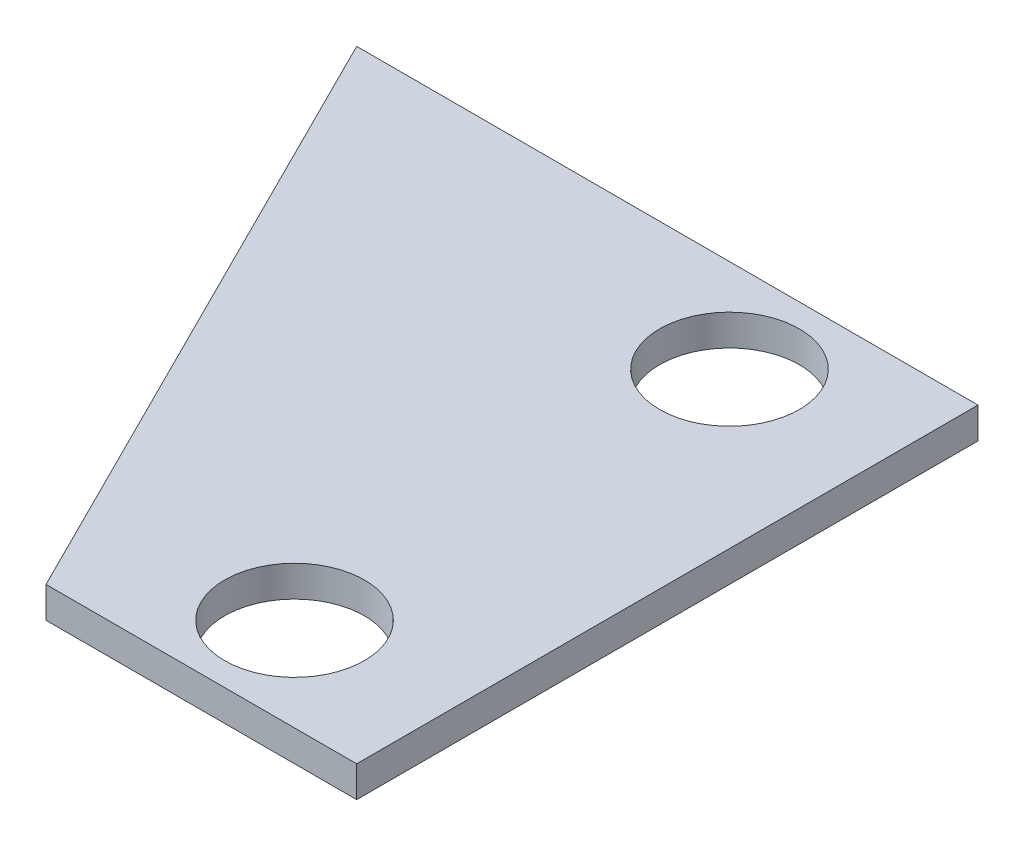
ISO-10303-21;
HEADER;
FILE_DESCRIPTION(('STEP AP214'),'2;1');
FILE_NAME('part.step','',(''),(''),'','','');
FILE_SCHEMA(('AUTOMOTIVE_DESIGN { 1 0 10303 214 1 1 1 1 }'));
ENDSEC;
DATA;
#1=APPLICATION_CONTEXT('core data for automotive mechanical design processes');
#2=APPLICATION_PROTOCOL_DEFINITION('international standard','automotive_design',2000,#1);
#3=PRODUCT_CONTEXT('',#1,'mechanical');
#4=PRODUCT('Part','Part','',(#3));
#5=PRODUCT_RELATED_PRODUCT_CATEGORY('part','',(#4));
#6=PRODUCT_DEFINITION_FORMATION('','',#4);
#7=PRODUCT_DEFINITION_CONTEXT('part definition',#1,'design');
#8=PRODUCT_DEFINITION('design','',#6,#7);
#9=PRODUCT_DEFINITION_SHAPE('','',#8);
#10=(LENGTH_UNIT() NAMED_UNIT(*) SI_UNIT(.MILLI.,.METRE.));
#11=(NAMED_UNIT(*) PLANE_ANGLE_UNIT() SI_UNIT($,.RADIAN.));
#12=(NAMED_UNIT(*) SI_UNIT($,.STERADIAN.) SOLID_ANGLE_UNIT());
#13=UNCERTAINTY_MEASURE_WITH_UNIT(LENGTH_MEASURE(1.E-05),#10,'distance_accuracy_value','');
#14=(GEOMETRIC_REPRESENTATION_CONTEXT(3) GLOBAL_UNCERTAINTY_ASSIGNED_CONTEXT((#13)) GLOBAL_UNIT_ASSIGNED_CONTEXT((#10,
#11,#12)) REPRESENTATION_CONTEXT('',''));
#15=CARTESIAN_POINT('',(0.,0.,0.));
#16=DIRECTION('',(0.,0.,1.));
#17=DIRECTION('',(1.,0.,0.));
#18=AXIS2_PLACEMENT_3D('',#15,#16,#17);
#19=CARTESIAN_POINT('',(0.,1.,0.));
#20=DIRECTION('',(0.,-1.,0.));
#21=DIRECTION('',(0.,0.,-1.));
#22=AXIS2_PLACEMENT_3D('',#19,#20,#21);
#23=PLANE('',#22);
#24=DIRECTION('',(-1.,0.,0.));
#25=VECTOR('',#24,1.);
#26=CARTESIAN_POINT('',(-15.,1.,-10.));
#27=LINE('',#26,#25);
#28=CARTESIAN_POINT('',(5.,1.,-10.));
#29=VERTEX_POINT('',#28);
#30=CARTESIAN_POINT('',(-15.,1.,-10.));
#31=VERTEX_POINT('',#30);
#32=EDGE_CURVE('E50',#29,#31,#27,.T.);
#33=ORIENTED_EDGE('',*,*,#32,.T.);
#34=DIRECTION('',(0.447213595499958,0.,0.894427190999916));
#35=VECTOR('',#34,1.);
#36=CARTESIAN_POINT('',(-5.,1.,10.));
#37=LINE('',#36,#35);
#38=CARTESIAN_POINT('',(-5.,1.,10.));
#39=VERTEX_POINT('',#38);
#40=EDGE_CURVE('E81',#31,#39,#37,.T.);
#41=ORIENTED_EDGE('',*,*,#40,.T.);
#42=DIRECTION('',(1.,0.,0.));
#43=VECTOR('',#42,1.);
#44=CARTESIAN_POINT('',(-5.,1.,10.));
#45=LINE('',#44,#43);
#46=CARTESIAN_POINT('',(5.,1.,10.));
#47=VERTEX_POINT('',#46);
#48=EDGE_CURVE('E85',#39,#47,#45,.T.);
#49=ORIENTED_EDGE('',*,*,#48,.T.);
#50=DIRECTION('',(0.,0.,-1.));
#51=VECTOR('',#50,1.);
#52=CARTESIAN_POINT('',(5.,1.,-10.));
#53=LINE('',#52,#51);
#54=EDGE_CURVE('E92',#47,#29,#53,.T.);
#55=ORIENTED_EDGE('',*,*,#54,.T.);
#56=EDGE_LOOP('',(#33,#41,#49,#55));
#57=FACE_BOUND('',#56,.T.);
#58=CARTESIAN_POINT('',(0.,1.,-7.));
#59=DIRECTION('',(0.,1.,0.));
#60=DIRECTION('',(0.,0.,1.));
#61=AXIS2_PLACEMENT_3D('',#58,#59,#60);
#62=CIRCLE('',#61,2.25);
#63=CARTESIAN_POINT('',(0.,1.,-4.75));
#64=VERTEX_POINT('',#63);
#65=EDGE_CURVE('E99',#64,#64,#62,.T.);
#66=ORIENTED_EDGE('',*,*,#65,.F.);
#67=EDGE_LOOP('',(#66));
#68=FACE_BOUND('',#67,.T.);
#69=CARTESIAN_POINT('',(0.,1.,7.));
#70=DIRECTION('',(0.,1.,0.));
#71=DIRECTION('',(0.,0.,1.));
#72=AXIS2_PLACEMENT_3D('',#69,#70,#71);
#73=CIRCLE('',#72,2.25);
#74=CARTESIAN_POINT('',(0.,1.,9.25));
#75=VERTEX_POINT('',#74);
#76=EDGE_CURVE('E137',#75,#75,#73,.T.);
#77=ORIENTED_EDGE('',*,*,#76,.F.);
#78=EDGE_LOOP('',(#77));
#79=FACE_BOUND('',#78,.T.);
#80=ADVANCED_FACE('F33',(#57,#68,#79),#23,.F.);
#81=CARTESIAN_POINT('',(0.,0.,0.));
#82=DIRECTION('',(0.,-1.,0.));
#83=DIRECTION('',(0.,0.,-1.));
#84=AXIS2_PLACEMENT_3D('',#81,#82,#83);
#85=PLANE('',#84);
#86=CARTESIAN_POINT('',(0.,0.,-7.));
#87=DIRECTION('',(0.,1.,0.));
#88=DIRECTION('',(0.,0.,1.));
#89=AXIS2_PLACEMENT_3D('',#86,#87,#88);
#90=CIRCLE('',#89,2.25);
#91=CARTESIAN_POINT('',(0.,0.,-4.75));
#92=VERTEX_POINT('',#91);
#93=EDGE_CURVE('E142',#92,#92,#90,.T.);
#94=ORIENTED_EDGE('',*,*,#93,.T.);
#95=EDGE_LOOP('',(#94));
#96=FACE_BOUND('',#95,.T.);
#97=DIRECTION('',(0.447213595499958,0.,0.894427190999916));
#98=VECTOR('',#97,1.);
#99=CARTESIAN_POINT('',(-5.,0.,10.));
#100=LINE('',#99,#98);
#101=CARTESIAN_POINT('',(-15.,0.,-10.));
#102=VERTEX_POINT('',#101);
#103=CARTESIAN_POINT('',(-5.,0.,10.));
#104=VERTEX_POINT('',#103);
#105=EDGE_CURVE('E88',#102,#104,#100,.T.);
#106=ORIENTED_EDGE('',*,*,#105,.F.);
#107=DIRECTION('',(-1.,0.,0.));
#108=VECTOR('',#107,1.);
#109=CARTESIAN_POINT('',(-5.,0.,-10.));
#110=LINE('',#109,#108);
#111=CARTESIAN_POINT('',(5.,0.,-10.));
#112=VERTEX_POINT('',#111);
#113=EDGE_CURVE('E102',#112,#102,#110,.T.);
#114=ORIENTED_EDGE('',*,*,#113,.F.);
#115=DIRECTION('',(0.,0.,-1.));
#116=VECTOR('',#115,1.);
#117=CARTESIAN_POINT('',(5.,0.,-10.));
#118=LINE('',#117,#116);
#119=CARTESIAN_POINT('',(5.,0.,10.));
#120=VERTEX_POINT('',#119);
#121=EDGE_CURVE('E75',#120,#112,#118,.T.);
#122=ORIENTED_EDGE('',*,*,#121,.F.);
#123=DIRECTION('',(1.,0.,0.));
#124=VECTOR('',#123,1.);
#125=CARTESIAN_POINT('',(-5.,0.,10.));
#126=LINE('',#125,#124);
#127=EDGE_CURVE('E68',#104,#120,#126,.T.);
#128=ORIENTED_EDGE('',*,*,#127,.F.);
#129=EDGE_LOOP('',(#106,#114,#122,#128));
#130=FACE_BOUND('',#129,.T.);
#131=CARTESIAN_POINT('',(0.,0.,7.));
#132=DIRECTION('',(0.,1.,0.));
#133=DIRECTION('',(0.,0.,1.));
#134=AXIS2_PLACEMENT_3D('',#131,#132,#133);
#135=CIRCLE('',#134,2.25);
#136=CARTESIAN_POINT('',(0.,0.,9.25));
#137=VERTEX_POINT('',#136);
#138=EDGE_CURVE('E140',#137,#137,#135,.T.);
#139=ORIENTED_EDGE('',*,*,#138,.T.);
#140=EDGE_LOOP('',(#139));
#141=FACE_BOUND('',#140,.T.);
#142=ADVANCED_FACE('F108',(#96,#130,#141),#85,.T.);
#143=CARTESIAN_POINT('',(-5.,1.,10.));
#144=DIRECTION('',(0.894427190999916,0.,-0.447213595499958));
#145=DIRECTION('',(-0.447213595499958,0.,-0.894427190999916));
#146=AXIS2_PLACEMENT_3D('',#143,#144,#145);
#147=PLANE('',#146);
#148=ORIENTED_EDGE('',*,*,#105,.T.);
#149=DIRECTION('',(0.,-1.,0.));
#150=VECTOR('',#149,1.);
#151=CARTESIAN_POINT('',(-5.,1.,10.));
#152=LINE('',#151,#150);
#153=EDGE_CURVE('E42',#39,#104,#152,.T.);
#154=ORIENTED_EDGE('',*,*,#153,.F.);
#155=ORIENTED_EDGE('',*,*,#40,.F.);
#156=DIRECTION('',(0.,-1.,0.));
#157=VECTOR('',#156,1.);
#158=CARTESIAN_POINT('',(-15.,1.,-10.));
#159=LINE('',#158,#157);
#160=EDGE_CURVE('E11',#31,#102,#159,.T.);
#161=ORIENTED_EDGE('',*,*,#160,.T.);
#162=EDGE_LOOP('',(#148,#154,#155,#161));
#163=FACE_BOUND('',#162,.T.);
#164=ADVANCED_FACE('F35',(#163),#147,.F.);
#165=CARTESIAN_POINT('',(-5.,1.,10.));
#166=DIRECTION('',(0.,0.,-1.));
#167=DIRECTION('',(-1.,0.,0.));
#168=AXIS2_PLACEMENT_3D('',#165,#166,#167);
#169=PLANE('',#168);
#170=ORIENTED_EDGE('',*,*,#127,.T.);
#171=DIRECTION('',(0.,-1.,0.));
#172=VECTOR('',#171,1.);
#173=CARTESIAN_POINT('',(5.,1.,10.));
#174=LINE('',#173,#172);
#175=EDGE_CURVE('E89',#47,#120,#174,.T.);
#176=ORIENTED_EDGE('',*,*,#175,.F.);
#177=ORIENTED_EDGE('',*,*,#48,.F.);
#178=ORIENTED_EDGE('',*,*,#153,.T.);
#179=EDGE_LOOP('',(#170,#176,#177,#178));
#180=FACE_BOUND('',#179,.T.);
#181=ADVANCED_FACE('F90',(#180),#169,.F.);
#182=CARTESIAN_POINT('',(5.,1.,-10.));
#183=DIRECTION('',(-1.,0.,0.));
#184=DIRECTION('',(0.,0.,1.));
#185=AXIS2_PLACEMENT_3D('',#182,#183,#184);
#186=PLANE('',#185);
#187=ORIENTED_EDGE('',*,*,#121,.T.);
#188=DIRECTION('',(0.,-1.,0.));
#189=VECTOR('',#188,1.);
#190=CARTESIAN_POINT('',(5.,1.,-10.));
#191=LINE('',#190,#189);
#192=EDGE_CURVE('E94',#29,#112,#191,.T.);
#193=ORIENTED_EDGE('',*,*,#192,.F.);
#194=ORIENTED_EDGE('',*,*,#54,.F.);
#195=ORIENTED_EDGE('',*,*,#175,.T.);
#196=EDGE_LOOP('',(#187,#193,#194,#195));
#197=FACE_BOUND('',#196,.T.);
#198=ADVANCED_FACE('F105',(#197),#186,.F.);
#199=CARTESIAN_POINT('',(-5.,1.,-10.));
#200=DIRECTION('',(0.,0.,1.));
#201=DIRECTION('',(1.,0.,0.));
#202=AXIS2_PLACEMENT_3D('',#199,#200,#201);
#203=PLANE('',#202);
#204=ORIENTED_EDGE('',*,*,#113,.T.);
#205=ORIENTED_EDGE('',*,*,#160,.F.);
#206=ORIENTED_EDGE('',*,*,#32,.F.);
#207=ORIENTED_EDGE('',*,*,#192,.T.);
#208=EDGE_LOOP('',(#204,#205,#206,#207));
#209=FACE_BOUND('',#208,.T.);
#210=ADVANCED_FACE('F110',(#209),#203,.F.);
#211=CARTESIAN_POINT('',(0.,1.,-7.));
#212=DIRECTION('',(0.,-1.,0.));
#213=DIRECTION('',(0.,0.,-1.));
#214=AXIS2_PLACEMENT_3D('',#211,#212,#213);
#215=CYLINDRICAL_SURFACE('',#214,2.25);
#216=ORIENTED_EDGE('',*,*,#65,.T.);
#217=EDGE_LOOP('',(#216));
#218=FACE_BOUND('',#217,.T.);
#219=ORIENTED_EDGE('',*,*,#93,.F.);
#220=EDGE_LOOP('',(#219));
#221=FACE_BOUND('',#220,.T.);
#222=ADVANCED_FACE('F112',(#218,#221),#215,.F.);
#223=CARTESIAN_POINT('',(0.,1.,7.));
#224=DIRECTION('',(0.,-1.,0.));
#225=DIRECTION('',(0.,0.,-1.));
#226=AXIS2_PLACEMENT_3D('',#223,#224,#225);
#227=CYLINDRICAL_SURFACE('',#226,2.25);
#228=ORIENTED_EDGE('',*,*,#76,.T.);
#229=EDGE_LOOP('',(#228));
#230=FACE_BOUND('',#229,.T.);
#231=ORIENTED_EDGE('',*,*,#138,.F.);
#232=EDGE_LOOP('',(#231));
#233=FACE_BOUND('',#232,.T.);
#234=ADVANCED_FACE('F118',(#230,#233),#227,.F.);
#235=CLOSED_SHELL('',(#80,#142,#164,#181,#198,#210,#222,#234));
#236=MANIFOLD_SOLID_BREP('B2',#235);
#237=ADVANCED_BREP_SHAPE_REPRESENTATION('',(#18,#236),#14);
#238=SHAPE_DEFINITION_REPRESENTATION(#9,#237);
ENDSEC;
END-ISO-10303-21;
